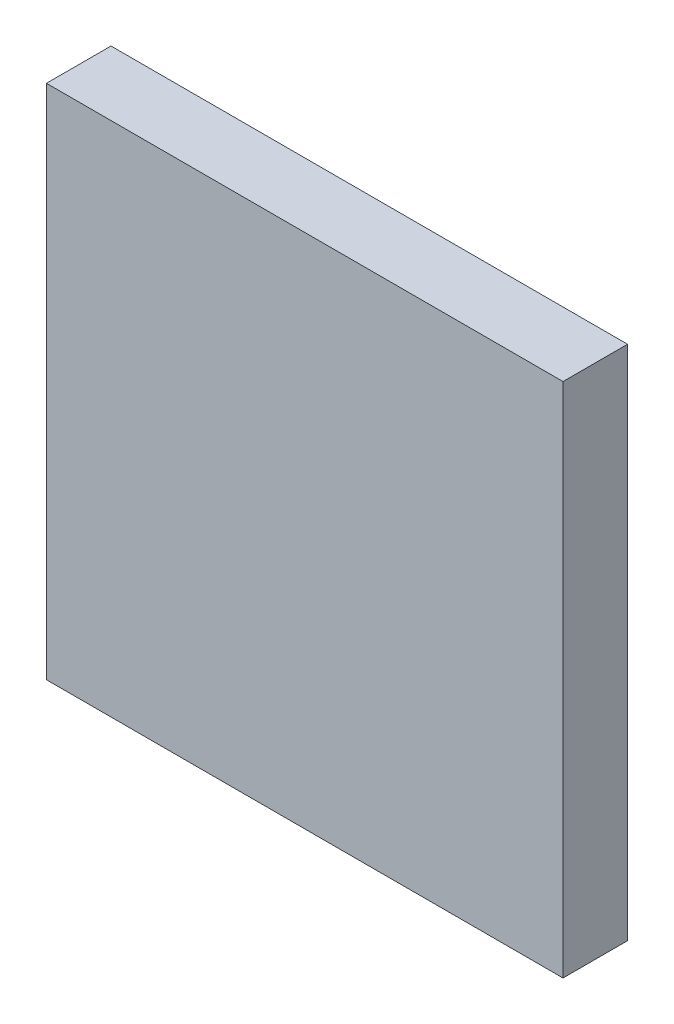
ISO-10303-21;
HEADER;
FILE_DESCRIPTION(('STEP AP214'),'2;1');
FILE_NAME('part.step','',(''),(''),'','','');
FILE_SCHEMA(('AUTOMOTIVE_DESIGN { 1 0 10303 214 1 1 1 1 }'));
ENDSEC;
DATA;
#1=APPLICATION_CONTEXT('core data for automotive mechanical design processes');
#2=APPLICATION_PROTOCOL_DEFINITION('international standard','automotive_design',2000,#1);
#3=PRODUCT_CONTEXT('',#1,'mechanical');
#4=PRODUCT('Part','Part','',(#3));
#5=PRODUCT_RELATED_PRODUCT_CATEGORY('part','',(#4));
#6=PRODUCT_DEFINITION_FORMATION('','',#4);
#7=PRODUCT_DEFINITION_CONTEXT('part definition',#1,'design');
#8=PRODUCT_DEFINITION('design','',#6,#7);
#9=PRODUCT_DEFINITION_SHAPE('','',#8);
#10=(LENGTH_UNIT() NAMED_UNIT(*) SI_UNIT(.MILLI.,.METRE.));
#11=(NAMED_UNIT(*) PLANE_ANGLE_UNIT() SI_UNIT($,.RADIAN.));
#12=(NAMED_UNIT(*) SI_UNIT($,.STERADIAN.) SOLID_ANGLE_UNIT());
#13=UNCERTAINTY_MEASURE_WITH_UNIT(LENGTH_MEASURE(1.E-05),#10,'distance_accuracy_value','');
#14=(GEOMETRIC_REPRESENTATION_CONTEXT(3) GLOBAL_UNCERTAINTY_ASSIGNED_CONTEXT((#13)) GLOBAL_UNIT_ASSIGNED_CONTEXT((#10,
#11,#12)) REPRESENTATION_CONTEXT('',''));
#15=CARTESIAN_POINT('',(0.,0.,0.));
#16=DIRECTION('',(0.,0.,1.));
#17=DIRECTION('',(1.,0.,0.));
#18=AXIS2_PLACEMENT_3D('',#15,#16,#17);
#19=CARTESIAN_POINT('',(200.,200.,50.));
#20=DIRECTION('',(-1.,0.,0.));
#21=DIRECTION('',(0.,-1.,0.));
#22=AXIS2_PLACEMENT_3D('',#19,#20,#21);
#23=PLANE('',#22);
#24=DIRECTION('',(0.,1.,0.));
#25=VECTOR('',#24,1.);
#26=CARTESIAN_POINT('',(200.,200.,0.));
#27=LINE('',#26,#25);
#28=CARTESIAN_POINT('',(200.,-200.,0.));
#29=VERTEX_POINT('',#28);
#30=CARTESIAN_POINT('',(200.,200.,0.));
#31=VERTEX_POINT('',#30);
#32=EDGE_CURVE('E96',#29,#31,#27,.T.);
#33=ORIENTED_EDGE('',*,*,#32,.T.);
#34=DIRECTION('',(0.,0.,-1.));
#35=VECTOR('',#34,1.);
#36=CARTESIAN_POINT('',(200.,200.,50.));
#37=LINE('',#36,#35);
#38=CARTESIAN_POINT('',(200.,200.,50.));
#39=VERTEX_POINT('',#38);
#40=EDGE_CURVE('E11',#39,#31,#37,.T.);
#41=ORIENTED_EDGE('',*,*,#40,.F.);
#42=DIRECTION('',(0.,1.,0.));
#43=VECTOR('',#42,1.);
#44=CARTESIAN_POINT('',(200.,200.,50.));
#45=LINE('',#44,#43);
#46=CARTESIAN_POINT('',(200.,-200.,50.));
#47=VERTEX_POINT('',#46);
#48=EDGE_CURVE('E84',#47,#39,#45,.T.);
#49=ORIENTED_EDGE('',*,*,#48,.F.);
#50=DIRECTION('',(0.,0.,-1.));
#51=VECTOR('',#50,1.);
#52=CARTESIAN_POINT('',(200.,-200.,50.));
#53=LINE('',#52,#51);
#54=EDGE_CURVE('E92',#47,#29,#53,.T.);
#55=ORIENTED_EDGE('',*,*,#54,.T.);
#56=EDGE_LOOP('',(#33,#41,#49,#55));
#57=FACE_BOUND('',#56,.T.);
#58=ADVANCED_FACE('F33',(#57),#23,.F.);
#59=CARTESIAN_POINT('',(-200.,200.,50.));
#60=DIRECTION('',(0.,-1.,0.));
#61=DIRECTION('',(0.,0.,-1.));
#62=AXIS2_PLACEMENT_3D('',#59,#60,#61);
#63=PLANE('',#62);
#64=DIRECTION('',(-1.,0.,0.));
#65=VECTOR('',#64,1.);
#66=CARTESIAN_POINT('',(-200.,200.,0.));
#67=LINE('',#66,#65);
#68=CARTESIAN_POINT('',(-200.,200.,0.));
#69=VERTEX_POINT('',#68);
#70=EDGE_CURVE('E88',#31,#69,#67,.T.);
#71=ORIENTED_EDGE('',*,*,#70,.T.);
#72=DIRECTION('',(0.,0.,-1.));
#73=VECTOR('',#72,1.);
#74=CARTESIAN_POINT('',(-200.,200.,50.));
#75=LINE('',#74,#73);
#76=CARTESIAN_POINT('',(-200.,200.,50.));
#77=VERTEX_POINT('',#76);
#78=EDGE_CURVE('E41',#77,#69,#75,.T.);
#79=ORIENTED_EDGE('',*,*,#78,.F.);
#80=DIRECTION('',(-1.,0.,0.));
#81=VECTOR('',#80,1.);
#82=CARTESIAN_POINT('',(-200.,200.,50.));
#83=LINE('',#82,#81);
#84=EDGE_CURVE('E79',#39,#77,#83,.T.);
#85=ORIENTED_EDGE('',*,*,#84,.F.);
#86=ORIENTED_EDGE('',*,*,#40,.T.);
#87=EDGE_LOOP('',(#71,#79,#85,#86));
#88=FACE_BOUND('',#87,.T.);
#89=ADVANCED_FACE('F87',(#88),#63,.F.);
#90=CARTESIAN_POINT('',(-200.,200.,50.));
#91=DIRECTION('',(1.,0.,0.));
#92=DIRECTION('',(0.,1.,0.));
#93=AXIS2_PLACEMENT_3D('',#90,#91,#92);
#94=PLANE('',#93);
#95=DIRECTION('',(0.,-1.,0.));
#96=VECTOR('',#95,1.);
#97=CARTESIAN_POINT('',(-200.,200.,0.));
#98=LINE('',#97,#96);
#99=CARTESIAN_POINT('',(-200.,-200.,0.));
#100=VERTEX_POINT('',#99);
#101=EDGE_CURVE('E66',#69,#100,#98,.T.);
#102=ORIENTED_EDGE('',*,*,#101,.T.);
#103=DIRECTION('',(0.,0.,-1.));
#104=VECTOR('',#103,1.);
#105=CARTESIAN_POINT('',(-200.,-200.,50.));
#106=LINE('',#105,#104);
#107=CARTESIAN_POINT('',(-200.,-200.,50.));
#108=VERTEX_POINT('',#107);
#109=EDGE_CURVE('E89',#108,#100,#106,.T.);
#110=ORIENTED_EDGE('',*,*,#109,.F.);
#111=DIRECTION('',(0.,-1.,0.));
#112=VECTOR('',#111,1.);
#113=CARTESIAN_POINT('',(-200.,200.,50.));
#114=LINE('',#113,#112);
#115=EDGE_CURVE('E82',#77,#108,#114,.T.);
#116=ORIENTED_EDGE('',*,*,#115,.F.);
#117=ORIENTED_EDGE('',*,*,#78,.T.);
#118=EDGE_LOOP('',(#102,#110,#116,#117));
#119=FACE_BOUND('',#118,.T.);
#120=ADVANCED_FACE('F90',(#119),#94,.F.);
#121=CARTESIAN_POINT('',(-200.,-200.,50.));
#122=DIRECTION('',(0.,1.,0.));
#123=DIRECTION('',(0.,0.,1.));
#124=AXIS2_PLACEMENT_3D('',#121,#122,#123);
#125=PLANE('',#124);
#126=DIRECTION('',(1.,0.,0.));
#127=VECTOR('',#126,1.);
#128=CARTESIAN_POINT('',(-200.,-200.,0.));
#129=LINE('',#128,#127);
#130=EDGE_CURVE('E72',#100,#29,#129,.T.);
#131=ORIENTED_EDGE('',*,*,#130,.T.);
#132=ORIENTED_EDGE('',*,*,#54,.F.);
#133=DIRECTION('',(1.,0.,0.));
#134=VECTOR('',#133,1.);
#135=CARTESIAN_POINT('',(-200.,-200.,50.));
#136=LINE('',#135,#134);
#137=EDGE_CURVE('E49',#108,#47,#136,.T.);
#138=ORIENTED_EDGE('',*,*,#137,.F.);
#139=ORIENTED_EDGE('',*,*,#109,.T.);
#140=EDGE_LOOP('',(#131,#132,#138,#139));
#141=FACE_BOUND('',#140,.T.);
#142=ADVANCED_FACE('F103',(#141),#125,.F.);
#143=CARTESIAN_POINT('',(0.,0.,50.));
#144=DIRECTION('',(0.,0.,1.));
#145=DIRECTION('',(1.,0.,0.));
#146=AXIS2_PLACEMENT_3D('',#143,#144,#145);
#147=PLANE('',#146);
#148=ORIENTED_EDGE('',*,*,#48,.T.);
#149=ORIENTED_EDGE('',*,*,#84,.T.);
#150=ORIENTED_EDGE('',*,*,#115,.T.);
#151=ORIENTED_EDGE('',*,*,#137,.T.);
#152=EDGE_LOOP('',(#148,#149,#150,#151));
#153=FACE_BOUND('',#152,.T.);
#154=ADVANCED_FACE('F80',(#153),#147,.T.);
#155=CARTESIAN_POINT('',(0.,0.,0.));
#156=DIRECTION('',(0.,0.,1.));
#157=DIRECTION('',(1.,0.,0.));
#158=AXIS2_PLACEMENT_3D('',#155,#156,#157);
#159=PLANE('',#158);
#160=ORIENTED_EDGE('',*,*,#32,.F.);
#161=ORIENTED_EDGE('',*,*,#130,.F.);
#162=ORIENTED_EDGE('',*,*,#101,.F.);
#163=ORIENTED_EDGE('',*,*,#70,.F.);
#164=EDGE_LOOP('',(#160,#161,#162,#163));
#165=FACE_BOUND('',#164,.T.);
#166=ADVANCED_FACE('F106',(#165),#159,.F.);
#167=CLOSED_SHELL('',(#58,#89,#120,#142,#154,#166));
#168=MANIFOLD_SOLID_BREP('B2',#167);
#169=ADVANCED_BREP_SHAPE_REPRESENTATION('',(#18,#168),#14);
#170=SHAPE_DEFINITION_REPRESENTATION(#9,#169);
ENDSEC;
END-ISO-10303-21;
